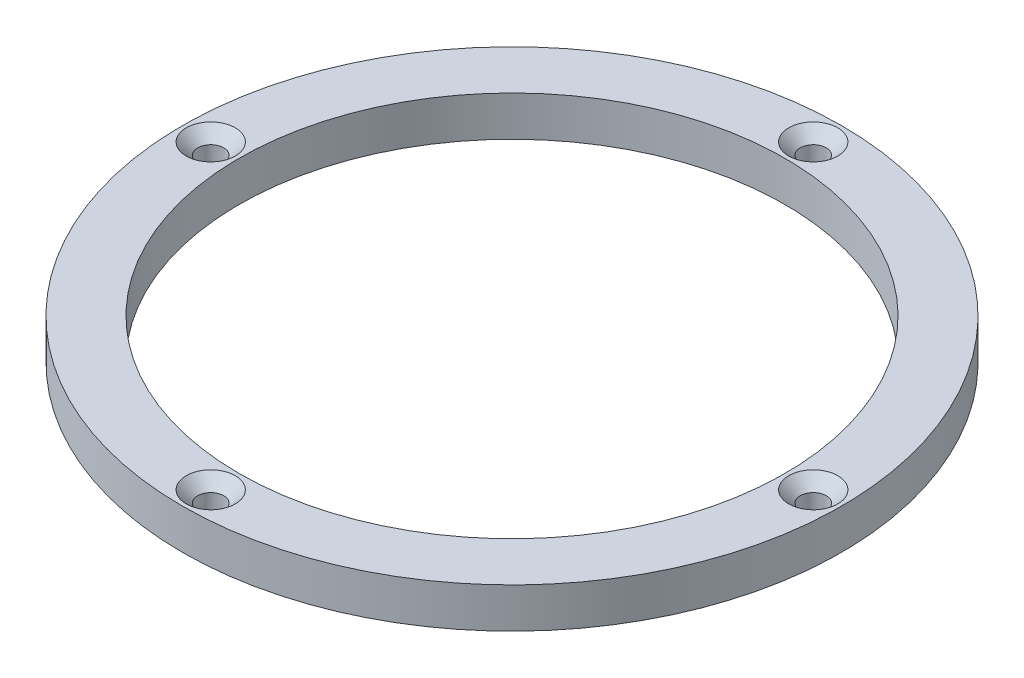
ISO-10303-21;
HEADER;
FILE_DESCRIPTION(('STEP AP214'),'2;1');
FILE_NAME('part.step','',(''),(''),'','','');
FILE_SCHEMA(('AUTOMOTIVE_DESIGN { 1 0 10303 214 1 1 1 1 }'));
ENDSEC;
DATA;
#1=APPLICATION_CONTEXT('core data for automotive mechanical design processes');
#2=APPLICATION_PROTOCOL_DEFINITION('international standard','automotive_design',2000,#1);
#3=PRODUCT_CONTEXT('',#1,'mechanical');
#4=PRODUCT('Part','Part','',(#3));
#5=PRODUCT_RELATED_PRODUCT_CATEGORY('part','',(#4));
#6=PRODUCT_DEFINITION_FORMATION('','',#4);
#7=PRODUCT_DEFINITION_CONTEXT('part definition',#1,'design');
#8=PRODUCT_DEFINITION('design','',#6,#7);
#9=PRODUCT_DEFINITION_SHAPE('','',#8);
#10=(LENGTH_UNIT() NAMED_UNIT(*) SI_UNIT(.MILLI.,.METRE.));
#11=(NAMED_UNIT(*) PLANE_ANGLE_UNIT() SI_UNIT($,.RADIAN.));
#12=(NAMED_UNIT(*) SI_UNIT($,.STERADIAN.) SOLID_ANGLE_UNIT());
#13=UNCERTAINTY_MEASURE_WITH_UNIT(LENGTH_MEASURE(1.E-05),#10,'distance_accuracy_value','');
#14=(GEOMETRIC_REPRESENTATION_CONTEXT(3) GLOBAL_UNCERTAINTY_ASSIGNED_CONTEXT((#13)) GLOBAL_UNIT_ASSIGNED_CONTEXT((#10,
#11,#12)) REPRESENTATION_CONTEXT('',''));
#15=CARTESIAN_POINT('',(0.,0.,0.));
#16=DIRECTION('',(0.,0.,1.));
#17=DIRECTION('',(1.,0.,0.));
#18=AXIS2_PLACEMENT_3D('',#15,#16,#17);
#19=CARTESIAN_POINT('',(0.,8.5,0.));
#20=DIRECTION('',(0.,1.,0.));
#21=DIRECTION('',(0.,0.,1.));
#22=AXIS2_PLACEMENT_3D('',#19,#20,#21);
#23=PLANE('',#22);
#24=CARTESIAN_POINT('',(0.,8.5,-63.9));
#25=DIRECTION('',(0.,1.,0.));
#26=DIRECTION('',(0.,0.,1.));
#27=AXIS2_PLACEMENT_3D('',#24,#25,#26);
#28=CIRCLE('',#27,5.2);
#29=CARTESIAN_POINT('',(0.,8.5,-58.7));
#30=VERTEX_POINT('',#29);
#31=EDGE_CURVE('E120',#30,#30,#28,.T.);
#32=ORIENTED_EDGE('',*,*,#31,.F.);
#33=EDGE_LOOP('',(#32));
#34=FACE_BOUND('',#33,.T.);
#35=CARTESIAN_POINT('',(63.9,8.5,0.));
#36=DIRECTION('',(0.,1.,0.));
#37=DIRECTION('',(0.,0.,1.));
#38=AXIS2_PLACEMENT_3D('',#35,#36,#37);
#39=CIRCLE('',#38,5.2);
#40=CARTESIAN_POINT('',(63.9,8.5,5.2));
#41=VERTEX_POINT('',#40);
#42=EDGE_CURVE('E77',#41,#41,#39,.T.);
#43=ORIENTED_EDGE('',*,*,#42,.F.);
#44=EDGE_LOOP('',(#43));
#45=FACE_BOUND('',#44,.T.);
#46=CARTESIAN_POINT('',(0.,8.5,63.9));
#47=DIRECTION('',(0.,1.,0.));
#48=DIRECTION('',(0.,0.,1.));
#49=AXIS2_PLACEMENT_3D('',#46,#47,#48);
#50=CIRCLE('',#49,5.2);
#51=CARTESIAN_POINT('',(0.,8.5,69.1));
#52=VERTEX_POINT('',#51);
#53=EDGE_CURVE('E70',#52,#52,#50,.T.);
#54=ORIENTED_EDGE('',*,*,#53,.F.);
#55=EDGE_LOOP('',(#54));
#56=FACE_BOUND('',#55,.T.);
#57=CARTESIAN_POINT('',(-63.9,8.5,0.));
#58=DIRECTION('',(0.,1.,0.));
#59=DIRECTION('',(0.,0.,1.));
#60=AXIS2_PLACEMENT_3D('',#57,#58,#59);
#61=CIRCLE('',#60,5.2);
#62=CARTESIAN_POINT('',(-63.9,8.5,5.2));
#63=VERTEX_POINT('',#62);
#64=EDGE_CURVE('E66',#63,#63,#61,.T.);
#65=ORIENTED_EDGE('',*,*,#64,.F.);
#66=EDGE_LOOP('',(#65));
#67=FACE_BOUND('',#66,.T.);
#68=CARTESIAN_POINT('',(0.,8.5,0.));
#69=DIRECTION('',(0.,1.,0.));
#70=DIRECTION('',(0.,0.,1.));
#71=AXIS2_PLACEMENT_3D('',#68,#69,#70);
#72=CIRCLE('',#71,69.9);
#73=CARTESIAN_POINT('',(0.,8.5,69.9));
#74=VERTEX_POINT('',#73);
#75=EDGE_CURVE('E10',#74,#74,#72,.T.);
#76=ORIENTED_EDGE('',*,*,#75,.T.);
#77=EDGE_LOOP('',(#76));
#78=FACE_BOUND('',#77,.T.);
#79=CARTESIAN_POINT('',(0.,8.5,0.));
#80=DIRECTION('',(0.,1.,0.));
#81=DIRECTION('',(0.,0.,1.));
#82=AXIS2_PLACEMENT_3D('',#79,#80,#81);
#83=CIRCLE('',#82,57.9);
#84=CARTESIAN_POINT('',(0.,8.5,57.9));
#85=VERTEX_POINT('',#84);
#86=EDGE_CURVE('E54',#85,#85,#83,.T.);
#87=ORIENTED_EDGE('',*,*,#86,.F.);
#88=EDGE_LOOP('',(#87));
#89=FACE_BOUND('',#88,.T.);
#90=ADVANCED_FACE('F41',(#34,#45,#56,#67,#78,#89),#23,.T.);
#91=CARTESIAN_POINT('',(0.,0.,0.));
#92=DIRECTION('',(0.,1.,0.));
#93=DIRECTION('',(0.,0.,1.));
#94=AXIS2_PLACEMENT_3D('',#91,#92,#93);
#95=PLANE('',#94);
#96=CARTESIAN_POINT('',(0.,0.,-63.9));
#97=DIRECTION('',(0.,1.,0.));
#98=DIRECTION('',(0.,0.,1.));
#99=AXIS2_PLACEMENT_3D('',#96,#97,#98);
#100=CIRCLE('',#99,2.74999999999999);
#101=CARTESIAN_POINT('',(0.,0.,-61.15));
#102=VERTEX_POINT('',#101);
#103=EDGE_CURVE('E45',#102,#102,#100,.T.);
#104=ORIENTED_EDGE('',*,*,#103,.T.);
#105=EDGE_LOOP('',(#104));
#106=FACE_BOUND('',#105,.T.);
#107=CARTESIAN_POINT('',(63.9,0.,0.));
#108=DIRECTION('',(0.,1.,0.));
#109=DIRECTION('',(0.,0.,1.));
#110=AXIS2_PLACEMENT_3D('',#107,#108,#109);
#111=CIRCLE('',#110,2.74999999999999);
#112=CARTESIAN_POINT('',(63.9,0.,2.74999999999999));
#113=VERTEX_POINT('',#112);
#114=EDGE_CURVE('E68',#113,#113,#111,.T.);
#115=ORIENTED_EDGE('',*,*,#114,.T.);
#116=EDGE_LOOP('',(#115));
#117=FACE_BOUND('',#116,.T.);
#118=CARTESIAN_POINT('',(0.,0.,63.9));
#119=DIRECTION('',(0.,1.,0.));
#120=DIRECTION('',(0.,0.,1.));
#121=AXIS2_PLACEMENT_3D('',#118,#119,#120);
#122=CIRCLE('',#121,2.74999999999999);
#123=CARTESIAN_POINT('',(0.,0.,66.65));
#124=VERTEX_POINT('',#123);
#125=EDGE_CURVE('E64',#124,#124,#122,.T.);
#126=ORIENTED_EDGE('',*,*,#125,.T.);
#127=EDGE_LOOP('',(#126));
#128=FACE_BOUND('',#127,.T.);
#129=CARTESIAN_POINT('',(-63.9,0.,0.));
#130=DIRECTION('',(0.,1.,0.));
#131=DIRECTION('',(0.,0.,1.));
#132=AXIS2_PLACEMENT_3D('',#129,#130,#131);
#133=CIRCLE('',#132,2.74999999999999);
#134=CARTESIAN_POINT('',(-63.9,0.,2.74999999999999));
#135=VERTEX_POINT('',#134);
#136=EDGE_CURVE('E60',#135,#135,#133,.T.);
#137=ORIENTED_EDGE('',*,*,#136,.T.);
#138=EDGE_LOOP('',(#137));
#139=FACE_BOUND('',#138,.T.);
#140=CARTESIAN_POINT('',(0.,0.,0.));
#141=DIRECTION('',(0.,1.,0.));
#142=DIRECTION('',(0.,0.,1.));
#143=AXIS2_PLACEMENT_3D('',#140,#141,#142);
#144=CIRCLE('',#143,69.9);
#145=CARTESIAN_POINT('',(0.,0.,69.9));
#146=VERTEX_POINT('',#145);
#147=EDGE_CURVE('E49',#146,#146,#144,.T.);
#148=ORIENTED_EDGE('',*,*,#147,.F.);
#149=EDGE_LOOP('',(#148));
#150=FACE_BOUND('',#149,.T.);
#151=CARTESIAN_POINT('',(0.,0.,0.));
#152=DIRECTION('',(0.,1.,0.));
#153=DIRECTION('',(0.,0.,1.));
#154=AXIS2_PLACEMENT_3D('',#151,#152,#153);
#155=CIRCLE('',#154,57.9);
#156=CARTESIAN_POINT('',(0.,0.,57.9));
#157=VERTEX_POINT('',#156);
#158=EDGE_CURVE('E57',#157,#157,#155,.T.);
#159=ORIENTED_EDGE('',*,*,#158,.T.);
#160=EDGE_LOOP('',(#159));
#161=FACE_BOUND('',#160,.T.);
#162=ADVANCED_FACE('F96',(#106,#117,#128,#139,#150,#161),#95,.F.);
#163=CARTESIAN_POINT('',(0.,8.5,0.));
#164=DIRECTION('',(0.,-1.,0.));
#165=DIRECTION('',(0.,0.,-1.));
#166=AXIS2_PLACEMENT_3D('',#163,#164,#165);
#167=CYLINDRICAL_SURFACE('',#166,69.9);
#168=ORIENTED_EDGE('',*,*,#75,.F.);
#169=EDGE_LOOP('',(#168));
#170=FACE_BOUND('',#169,.T.);
#171=ORIENTED_EDGE('',*,*,#147,.T.);
#172=EDGE_LOOP('',(#171));
#173=FACE_BOUND('',#172,.T.);
#174=ADVANCED_FACE('F43',(#170,#173),#167,.T.);
#175=CARTESIAN_POINT('',(0.,8.5,0.));
#176=DIRECTION('',(0.,-1.,0.));
#177=DIRECTION('',(0.,0.,-1.));
#178=AXIS2_PLACEMENT_3D('',#175,#176,#177);
#179=CYLINDRICAL_SURFACE('',#178,57.9);
#180=ORIENTED_EDGE('',*,*,#86,.T.);
#181=EDGE_LOOP('',(#180));
#182=FACE_BOUND('',#181,.T.);
#183=ORIENTED_EDGE('',*,*,#158,.F.);
#184=EDGE_LOOP('',(#183));
#185=FACE_BOUND('',#184,.T.);
#186=ADVANCED_FACE('F98',(#182,#185),#179,.F.);
#187=CARTESIAN_POINT('',(-63.9,8.5,0.));
#188=DIRECTION('',(0.,1.,0.));
#189=DIRECTION('',(0.,0.,1.));
#190=AXIS2_PLACEMENT_3D('',#187,#188,#189);
#191=CYLINDRICAL_SURFACE('',#190,2.74999999999999);
#192=CARTESIAN_POINT('',(-63.9,6.04999999999999,0.));
#193=DIRECTION('',(0.,1.,0.));
#194=DIRECTION('',(0.,0.,1.));
#195=AXIS2_PLACEMENT_3D('',#192,#193,#194);
#196=CIRCLE('',#195,2.74999999999999);
#197=CARTESIAN_POINT('',(-63.9,6.04999999999999,2.74999999999999));
#198=VERTEX_POINT('',#197);
#199=EDGE_CURVE('E63',#198,#198,#196,.T.);
#200=ORIENTED_EDGE('',*,*,#199,.T.);
#201=EDGE_LOOP('',(#200));
#202=FACE_BOUND('',#201,.T.);
#203=ORIENTED_EDGE('',*,*,#136,.F.);
#204=EDGE_LOOP('',(#203));
#205=FACE_BOUND('',#204,.T.);
#206=ADVANCED_FACE('F100',(#202,#205),#191,.F.);
#207=CARTESIAN_POINT('',(-63.9,8.5,0.));
#208=DIRECTION('',(0.,1.,0.));
#209=DIRECTION('',(0.,0.,1.));
#210=AXIS2_PLACEMENT_3D('',#207,#208,#209);
#211=CONICAL_SURFACE('',#210,5.2,0.785398163397448);
#212=ORIENTED_EDGE('',*,*,#199,.F.);
#213=EDGE_LOOP('',(#212));
#214=FACE_BOUND('',#213,.T.);
#215=ORIENTED_EDGE('',*,*,#64,.T.);
#216=EDGE_LOOP('',(#215));
#217=FACE_BOUND('',#216,.T.);
#218=ADVANCED_FACE('F107',(#214,#217),#211,.F.);
#219=CARTESIAN_POINT('',(0.,8.5,63.9));
#220=DIRECTION('',(0.,1.,0.));
#221=DIRECTION('',(0.,0.,1.));
#222=AXIS2_PLACEMENT_3D('',#219,#220,#221);
#223=CYLINDRICAL_SURFACE('',#222,2.74999999999999);
#224=CARTESIAN_POINT('',(0.,6.04999999999999,63.9));
#225=DIRECTION('',(0.,1.,0.));
#226=DIRECTION('',(0.,0.,1.));
#227=AXIS2_PLACEMENT_3D('',#224,#225,#226);
#228=CIRCLE('',#227,2.74999999999999);
#229=CARTESIAN_POINT('',(0.,6.04999999999999,66.65));
#230=VERTEX_POINT('',#229);
#231=EDGE_CURVE('E67',#230,#230,#228,.T.);
#232=ORIENTED_EDGE('',*,*,#231,.T.);
#233=EDGE_LOOP('',(#232));
#234=FACE_BOUND('',#233,.T.);
#235=ORIENTED_EDGE('',*,*,#125,.F.);
#236=EDGE_LOOP('',(#235));
#237=FACE_BOUND('',#236,.T.);
#238=ADVANCED_FACE('F129',(#234,#237),#223,.F.);
#239=CARTESIAN_POINT('',(0.,8.5,63.9));
#240=DIRECTION('',(0.,1.,0.));
#241=DIRECTION('',(0.,0.,1.));
#242=AXIS2_PLACEMENT_3D('',#239,#240,#241);
#243=CONICAL_SURFACE('',#242,5.2,0.785398163397448);
#244=ORIENTED_EDGE('',*,*,#231,.F.);
#245=EDGE_LOOP('',(#244));
#246=FACE_BOUND('',#245,.T.);
#247=ORIENTED_EDGE('',*,*,#53,.T.);
#248=EDGE_LOOP('',(#247));
#249=FACE_BOUND('',#248,.T.);
#250=ADVANCED_FACE('F135',(#246,#249),#243,.F.);
#251=CARTESIAN_POINT('',(63.9,8.5,0.));
#252=DIRECTION('',(0.,1.,0.));
#253=DIRECTION('',(0.,0.,1.));
#254=AXIS2_PLACEMENT_3D('',#251,#252,#253);
#255=CYLINDRICAL_SURFACE('',#254,2.74999999999999);
#256=CARTESIAN_POINT('',(63.9,6.04999999999999,0.));
#257=DIRECTION('',(0.,1.,0.));
#258=DIRECTION('',(0.,0.,1.));
#259=AXIS2_PLACEMENT_3D('',#256,#257,#258);
#260=CIRCLE('',#259,2.74999999999999);
#261=CARTESIAN_POINT('',(63.9,6.04999999999999,2.74999999999999));
#262=VERTEX_POINT('',#261);
#263=EDGE_CURVE('E71',#262,#262,#260,.T.);
#264=ORIENTED_EDGE('',*,*,#263,.T.);
#265=EDGE_LOOP('',(#264));
#266=FACE_BOUND('',#265,.T.);
#267=ORIENTED_EDGE('',*,*,#114,.F.);
#268=EDGE_LOOP('',(#267));
#269=FACE_BOUND('',#268,.T.);
#270=ADVANCED_FACE('F142',(#266,#269),#255,.F.);
#271=CARTESIAN_POINT('',(63.9,8.5,0.));
#272=DIRECTION('',(0.,1.,0.));
#273=DIRECTION('',(0.,0.,1.));
#274=AXIS2_PLACEMENT_3D('',#271,#272,#273);
#275=CONICAL_SURFACE('',#274,5.2,0.785398163397448);
#276=ORIENTED_EDGE('',*,*,#263,.F.);
#277=EDGE_LOOP('',(#276));
#278=FACE_BOUND('',#277,.T.);
#279=ORIENTED_EDGE('',*,*,#42,.T.);
#280=EDGE_LOOP('',(#279));
#281=FACE_BOUND('',#280,.T.);
#282=ADVANCED_FACE('F146',(#278,#281),#275,.F.);
#283=CARTESIAN_POINT('',(0.,8.5,-63.9));
#284=DIRECTION('',(0.,1.,0.));
#285=DIRECTION('',(0.,0.,1.));
#286=AXIS2_PLACEMENT_3D('',#283,#284,#285);
#287=CYLINDRICAL_SURFACE('',#286,2.74999999999999);
#288=CARTESIAN_POINT('',(0.,6.04999999999999,-63.9));
#289=DIRECTION('',(0.,1.,0.));
#290=DIRECTION('',(0.,0.,1.));
#291=AXIS2_PLACEMENT_3D('',#288,#289,#290);
#292=CIRCLE('',#291,2.74999999999999);
#293=CARTESIAN_POINT('',(0.,6.04999999999999,-61.15));
#294=VERTEX_POINT('',#293);
#295=EDGE_CURVE('E162',#294,#294,#292,.T.);
#296=ORIENTED_EDGE('',*,*,#295,.T.);
#297=EDGE_LOOP('',(#296));
#298=FACE_BOUND('',#297,.T.);
#299=ORIENTED_EDGE('',*,*,#103,.F.);
#300=EDGE_LOOP('',(#299));
#301=FACE_BOUND('',#300,.T.);
#302=ADVANCED_FACE('F149',(#298,#301),#287,.F.);
#303=CARTESIAN_POINT('',(0.,8.5,-63.9));
#304=DIRECTION('',(0.,1.,0.));
#305=DIRECTION('',(0.,0.,1.));
#306=AXIS2_PLACEMENT_3D('',#303,#304,#305);
#307=CONICAL_SURFACE('',#306,5.2,0.785398163397448);
#308=ORIENTED_EDGE('',*,*,#295,.F.);
#309=EDGE_LOOP('',(#308));
#310=FACE_BOUND('',#309,.T.);
#311=ORIENTED_EDGE('',*,*,#31,.T.);
#312=EDGE_LOOP('',(#311));
#313=FACE_BOUND('',#312,.T.);
#314=ADVANCED_FACE('F153',(#310,#313),#307,.F.);
#315=CLOSED_SHELL('',(#90,#162,#174,#186,#206,#218,#238,#250,#270,#282,#302,#314));
#316=MANIFOLD_SOLID_BREP('B2',#315);
#317=ADVANCED_BREP_SHAPE_REPRESENTATION('',(#18,#316),#14);
#318=SHAPE_DEFINITION_REPRESENTATION(#9,#317);
ENDSEC;
END-ISO-10303-21;
